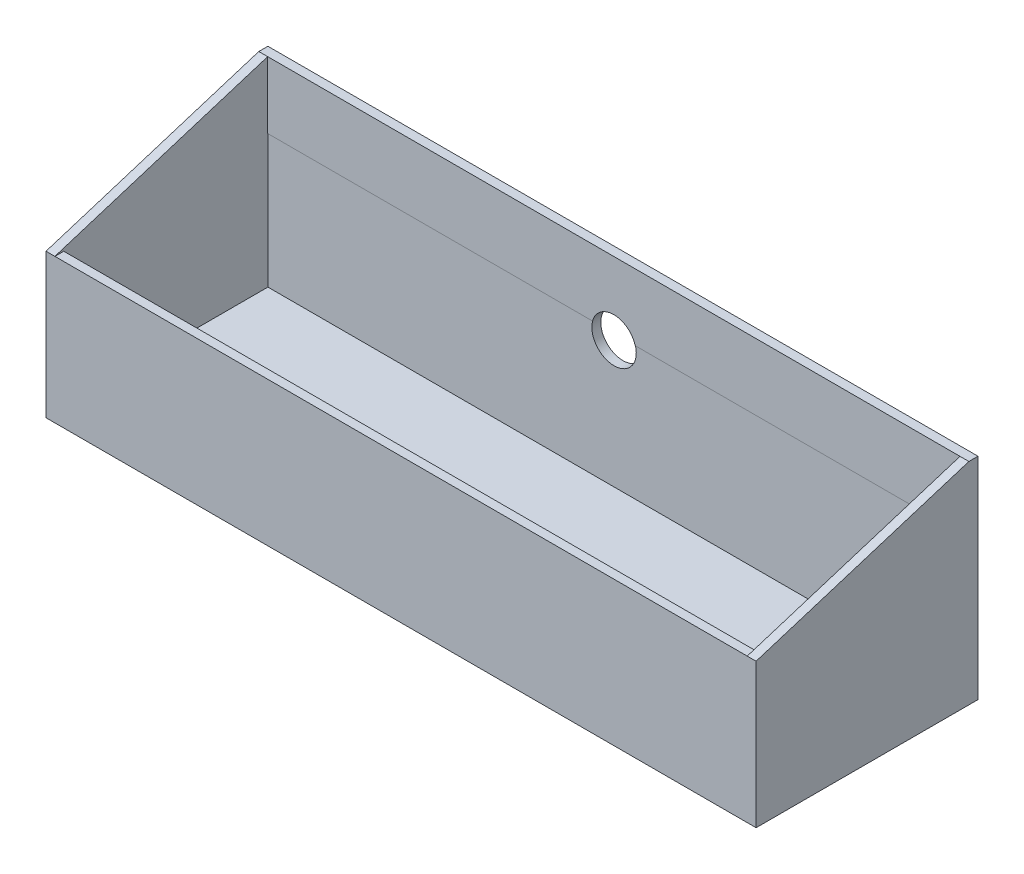
ISO-10303-21;
HEADER;
FILE_DESCRIPTION(('STEP AP214'),'2;1');
FILE_NAME('part.step','',(''),(''),'','','');
FILE_SCHEMA(('AUTOMOTIVE_DESIGN { 1 0 10303 214 1 1 1 1 }'));
ENDSEC;
DATA;
#1=APPLICATION_CONTEXT('core data for automotive mechanical design processes');
#2=APPLICATION_PROTOCOL_DEFINITION('international standard','automotive_design',2000,#1);
#3=PRODUCT_CONTEXT('',#1,'mechanical');
#4=PRODUCT('Part','Part','',(#3));
#5=PRODUCT_RELATED_PRODUCT_CATEGORY('part','',(#4));
#6=PRODUCT_DEFINITION_FORMATION('','',#4);
#7=PRODUCT_DEFINITION_CONTEXT('part definition',#1,'design');
#8=PRODUCT_DEFINITION('design','',#6,#7);
#9=PRODUCT_DEFINITION_SHAPE('','',#8);
#10=(LENGTH_UNIT() NAMED_UNIT(*) SI_UNIT(.MILLI.,.METRE.));
#11=(NAMED_UNIT(*) PLANE_ANGLE_UNIT() SI_UNIT($,.RADIAN.));
#12=(NAMED_UNIT(*) SI_UNIT($,.STERADIAN.) SOLID_ANGLE_UNIT());
#13=UNCERTAINTY_MEASURE_WITH_UNIT(LENGTH_MEASURE(1.E-05),#10,'distance_accuracy_value','');
#14=(GEOMETRIC_REPRESENTATION_CONTEXT(3) GLOBAL_UNCERTAINTY_ASSIGNED_CONTEXT((#13)) GLOBAL_UNIT_ASSIGNED_CONTEXT((#10,
#11,#12)) REPRESENTATION_CONTEXT('',''));
#15=CARTESIAN_POINT('',(0.,0.,0.));
#16=DIRECTION('',(0.,0.,1.));
#17=DIRECTION('',(1.,0.,0.));
#18=AXIS2_PLACEMENT_3D('',#15,#16,#17);
#19=CARTESIAN_POINT('',(0.,32.5,0.));
#20=DIRECTION('',(0.,1.,0.));
#21=DIRECTION('',(0.,0.,1.));
#22=AXIS2_PLACEMENT_3D('',#19,#20,#21);
#23=PLANE('',#22);
#24=DIRECTION('',(1.,0.,0.));
#25=VECTOR('',#24,1.);
#26=CARTESIAN_POINT('',(0.,32.5,2.04998441280679));
#27=LINE('',#26,#25);
#28=CARTESIAN_POINT('',(84.8152661770436,32.5,2.04998441280679));
#29=VERTEX_POINT('',#28);
#30=CARTESIAN_POINT('',(158.,32.5,2.04998441280679));
#31=VERTEX_POINT('',#30);
#32=EDGE_CURVE('E289',#29,#31,#27,.T.);
#33=ORIENTED_EDGE('',*,*,#32,.F.);
#34=DIRECTION('',(0.,0.,-1.));
#35=VECTOR('',#34,1.);
#36=CARTESIAN_POINT('',(84.8152661770436,32.5,3.));
#37=LINE('',#36,#35);
#38=CARTESIAN_POINT('',(84.8152661770436,32.5,2.));
#39=VERTEX_POINT('',#38);
#40=EDGE_CURVE('E11',#29,#39,#37,.T.);
#41=ORIENTED_EDGE('',*,*,#40,.T.);
#42=DIRECTION('',(-1.,0.,0.));
#43=VECTOR('',#42,1.);
#44=CARTESIAN_POINT('',(2.,32.5,2.));
#45=LINE('',#44,#43);
#46=CARTESIAN_POINT('',(158.,32.5,2.));
#47=VERTEX_POINT('',#46);
#48=EDGE_CURVE('E147',#47,#39,#45,.T.);
#49=ORIENTED_EDGE('',*,*,#48,.F.);
#50=DIRECTION('',(0.,0.,-1.));
#51=VECTOR('',#50,1.);
#52=CARTESIAN_POINT('',(158.,32.5,2.));
#53=LINE('',#52,#51);
#54=EDGE_CURVE('E166',#31,#47,#53,.T.);
#55=ORIENTED_EDGE('',*,*,#54,.F.);
#56=EDGE_LOOP('',(#33,#41,#49,#55));
#57=FACE_BOUND('',#56,.T.);
#58=ADVANCED_FACE('F33',(#57),#23,.F.);
#59=CARTESIAN_POINT('',(0.,32.5,0.));
#60=DIRECTION('',(0.,1.,0.));
#61=DIRECTION('',(0.,0.,1.));
#62=AXIS2_PLACEMENT_3D('',#59,#60,#61);
#63=PLANE('',#62);
#64=DIRECTION('',(1.,0.,0.));
#65=VECTOR('',#64,1.);
#66=CARTESIAN_POINT('',(2.,32.5,48.));
#67=LINE('',#66,#65);
#68=CARTESIAN_POINT('',(2.00000000000001,32.5,48.));
#69=VERTEX_POINT('',#68);
#70=CARTESIAN_POINT('',(158.,32.5,48.));
#71=VERTEX_POINT('',#70);
#72=EDGE_CURVE('E163',#69,#71,#67,.T.);
#73=ORIENTED_EDGE('',*,*,#72,.F.);
#74=DIRECTION('',(0.,0.,1.));
#75=VECTOR('',#74,1.);
#76=CARTESIAN_POINT('',(2.,32.5,2.04998441280679));
#77=LINE('',#76,#75);
#78=CARTESIAN_POINT('',(2.00000000000001,32.5,50.));
#79=VERTEX_POINT('',#78);
#80=EDGE_CURVE('E293',#69,#79,#77,.T.);
#81=ORIENTED_EDGE('',*,*,#80,.T.);
#82=DIRECTION('',(1.,0.,0.));
#83=VECTOR('',#82,1.);
#84=CARTESIAN_POINT('',(0.,32.5,50.));
#85=LINE('',#84,#83);
#86=CARTESIAN_POINT('',(158.,32.5,50.));
#87=VERTEX_POINT('',#86);
#88=EDGE_CURVE('E185',#79,#87,#85,.T.);
#89=ORIENTED_EDGE('',*,*,#88,.T.);
#90=DIRECTION('',(0.,0.,-1.));
#91=VECTOR('',#90,1.);
#92=CARTESIAN_POINT('',(158.,32.5,2.04998441280679));
#93=LINE('',#92,#91);
#94=EDGE_CURVE('E287',#87,#71,#93,.T.);
#95=ORIENTED_EDGE('',*,*,#94,.T.);
#96=EDGE_LOOP('',(#73,#81,#89,#95));
#97=FACE_BOUND('',#96,.T.);
#98=ADVANCED_FACE('F324',(#97),#63,.T.);
#99=CARTESIAN_POINT('',(0.,47.5,2.04998441280679));
#100=DIRECTION('',(0.,0.,-1.));
#101=DIRECTION('',(-1.,0.,0.));
#102=AXIS2_PLACEMENT_3D('',#99,#100,#101);
#103=PLANE('',#102);
#104=CARTESIAN_POINT('',(2.,32.5,2.04998441280679));
#105=VERTEX_POINT('',#104);
#106=CARTESIAN_POINT('',(75.1847338229564,32.5,2.04998441280679));
#107=VERTEX_POINT('',#106);
#108=EDGE_CURVE('E160',#105,#107,#27,.T.);
#109=ORIENTED_EDGE('',*,*,#108,.T.);
#110=CARTESIAN_POINT('',(80.,31.1534445261259,2.04998441280679));
#111=DIRECTION('',(0.,0.,-1.));
#112=DIRECTION('',(-1.,0.,0.));
#113=AXIS2_PLACEMENT_3D('',#110,#111,#112);
#114=CIRCLE('',#113,5.00000000000001);
#115=EDGE_CURVE('E48',#107,#29,#114,.T.);
#116=ORIENTED_EDGE('',*,*,#115,.T.);
#117=ORIENTED_EDGE('',*,*,#32,.T.);
#118=DIRECTION('',(0.,1.,0.));
#119=VECTOR('',#118,1.);
#120=CARTESIAN_POINT('',(158.,47.5,2.04998441280679));
#121=LINE('',#120,#119);
#122=CARTESIAN_POINT('',(158.,47.5,2.04998441280679));
#123=VERTEX_POINT('',#122);
#124=EDGE_CURVE('E292',#31,#123,#121,.T.);
#125=ORIENTED_EDGE('',*,*,#124,.T.);
#126=DIRECTION('',(1.,0.,0.));
#127=VECTOR('',#126,1.);
#128=CARTESIAN_POINT('',(0.,47.5,2.04998441280679));
#129=LINE('',#128,#127);
#130=CARTESIAN_POINT('',(2.,47.5,2.04998441280679));
#131=VERTEX_POINT('',#130);
#132=EDGE_CURVE('E280',#131,#123,#129,.T.);
#133=ORIENTED_EDGE('',*,*,#132,.F.);
#134=DIRECTION('',(0.,-1.,0.));
#135=VECTOR('',#134,1.);
#136=CARTESIAN_POINT('',(2.,47.5,2.04998441280679));
#137=LINE('',#136,#135);
#138=EDGE_CURVE('E304',#131,#105,#137,.T.);
#139=ORIENTED_EDGE('',*,*,#138,.T.);
#140=EDGE_LOOP('',(#109,#116,#117,#125,#133,#139));
#141=FACE_BOUND('',#140,.T.);
#142=ADVANCED_FACE('F330',(#141),#103,.F.);
#143=CARTESIAN_POINT('',(0.,2.5,0.));
#144=DIRECTION('',(1.,0.,0.));
#145=DIRECTION('',(0.,0.,-1.));
#146=AXIS2_PLACEMENT_3D('',#143,#144,#145);
#147=PLANE('',#146);
#148=DIRECTION('',(0.,-1.,0.));
#149=VECTOR('',#148,1.);
#150=CARTESIAN_POINT('',(0.,2.5,50.));
#151=LINE('',#150,#149);
#152=CARTESIAN_POINT('',(0.,32.5,50.));
#153=VERTEX_POINT('',#152);
#154=CARTESIAN_POINT('',(0.,0.,50.));
#155=VERTEX_POINT('',#154);
#156=EDGE_CURVE('E138',#153,#155,#151,.T.);
#157=ORIENTED_EDGE('',*,*,#156,.F.);
#158=DIRECTION('',(0.,0.298558220949294,-0.954391423213554));
#159=VECTOR('',#158,1.);
#160=CARTESIAN_POINT('',(0.,32.5,50.));
#161=LINE('',#160,#159);
#162=CARTESIAN_POINT('',(0.,47.5,2.04998441280679));
#163=VERTEX_POINT('',#162);
#164=EDGE_CURVE('E300',#153,#163,#161,.T.);
#165=ORIENTED_EDGE('',*,*,#164,.T.);
#166=DIRECTION('',(0.,0.,1.));
#167=VECTOR('',#166,1.);
#168=CARTESIAN_POINT('',(0.,47.5,0.));
#169=LINE('',#168,#167);
#170=CARTESIAN_POINT('',(0.,47.5,0.));
#171=VERTEX_POINT('',#170);
#172=EDGE_CURVE('E281',#171,#163,#169,.T.);
#173=ORIENTED_EDGE('',*,*,#172,.F.);
#174=DIRECTION('',(0.,-1.,0.));
#175=VECTOR('',#174,1.);
#176=CARTESIAN_POINT('',(0.,2.5,0.));
#177=LINE('',#176,#175);
#178=CARTESIAN_POINT('',(0.,0.,0.));
#179=VERTEX_POINT('',#178);
#180=EDGE_CURVE('E239',#171,#179,#177,.T.);
#181=ORIENTED_EDGE('',*,*,#180,.T.);
#182=DIRECTION('',(0.,0.,1.));
#183=VECTOR('',#182,1.);
#184=CARTESIAN_POINT('',(0.,0.,0.));
#185=LINE('',#184,#183);
#186=EDGE_CURVE('E228',#179,#155,#185,.T.);
#187=ORIENTED_EDGE('',*,*,#186,.T.);
#188=EDGE_LOOP('',(#157,#165,#173,#181,#187));
#189=FACE_BOUND('',#188,.T.);
#190=ADVANCED_FACE('F35',(#189),#147,.F.);
#191=CARTESIAN_POINT('',(0.,2.5,50.));
#192=DIRECTION('',(0.,0.,-1.));
#193=DIRECTION('',(-1.,0.,0.));
#194=AXIS2_PLACEMENT_3D('',#191,#192,#193);
#195=PLANE('',#194);
#196=DIRECTION('',(1.,0.,0.));
#197=VECTOR('',#196,1.);
#198=CARTESIAN_POINT('',(0.,0.,50.));
#199=LINE('',#198,#197);
#200=CARTESIAN_POINT('',(160.,0.,50.));
#201=VERTEX_POINT('',#200);
#202=EDGE_CURVE('E233',#155,#201,#199,.T.);
#203=ORIENTED_EDGE('',*,*,#202,.T.);
#204=DIRECTION('',(0.,-1.,0.));
#205=VECTOR('',#204,1.);
#206=CARTESIAN_POINT('',(160.,2.5,50.));
#207=LINE('',#206,#205);
#208=CARTESIAN_POINT('',(160.,32.5,50.));
#209=VERTEX_POINT('',#208);
#210=EDGE_CURVE('E245',#209,#201,#207,.T.);
#211=ORIENTED_EDGE('',*,*,#210,.F.);
#212=DIRECTION('',(1.,0.,0.));
#213=VECTOR('',#212,1.);
#214=CARTESIAN_POINT('',(158.,32.5,50.));
#215=LINE('',#214,#213);
#216=EDGE_CURVE('E286',#87,#209,#215,.T.);
#217=ORIENTED_EDGE('',*,*,#216,.F.);
#218=ORIENTED_EDGE('',*,*,#88,.F.);
#219=EDGE_CURVE('E186',#153,#79,#85,.T.);
#220=ORIENTED_EDGE('',*,*,#219,.F.);
#221=ORIENTED_EDGE('',*,*,#156,.T.);
#222=EDGE_LOOP('',(#203,#211,#217,#218,#220,#221));
#223=FACE_BOUND('',#222,.T.);
#224=ADVANCED_FACE('F252',(#223),#195,.F.);
#225=CARTESIAN_POINT('',(160.,2.5,0.));
#226=DIRECTION('',(-1.,0.,0.));
#227=DIRECTION('',(0.,0.,1.));
#228=AXIS2_PLACEMENT_3D('',#225,#226,#227);
#229=PLANE('',#228);
#230=DIRECTION('',(0.,0.,-1.));
#231=VECTOR('',#230,1.);
#232=CARTESIAN_POINT('',(160.,0.,0.));
#233=LINE('',#232,#231);
#234=CARTESIAN_POINT('',(160.,0.,0.));
#235=VERTEX_POINT('',#234);
#236=EDGE_CURVE('E235',#201,#235,#233,.T.);
#237=ORIENTED_EDGE('',*,*,#236,.T.);
#238=DIRECTION('',(0.,-1.,0.));
#239=VECTOR('',#238,1.);
#240=CARTESIAN_POINT('',(160.,2.5,0.));
#241=LINE('',#240,#239);
#242=CARTESIAN_POINT('',(160.,47.5,0.));
#243=VERTEX_POINT('',#242);
#244=EDGE_CURVE('E242',#243,#235,#241,.T.);
#245=ORIENTED_EDGE('',*,*,#244,.F.);
#246=DIRECTION('',(0.,0.,-1.));
#247=VECTOR('',#246,1.);
#248=CARTESIAN_POINT('',(160.,47.5,0.));
#249=LINE('',#248,#247);
#250=CARTESIAN_POINT('',(160.,47.5,2.04998441280679));
#251=VERTEX_POINT('',#250);
#252=EDGE_CURVE('E274',#251,#243,#249,.T.);
#253=ORIENTED_EDGE('',*,*,#252,.F.);
#254=DIRECTION('',(0.,-0.298558220949294,0.954391423213554));
#255=VECTOR('',#254,1.);
#256=CARTESIAN_POINT('',(160.,32.5,50.));
#257=LINE('',#256,#255);
#258=EDGE_CURVE('E290',#251,#209,#257,.T.);
#259=ORIENTED_EDGE('',*,*,#258,.T.);
#260=ORIENTED_EDGE('',*,*,#210,.T.);
#261=EDGE_LOOP('',(#237,#245,#253,#259,#260));
#262=FACE_BOUND('',#261,.T.);
#263=ADVANCED_FACE('F264',(#262),#229,.F.);
#264=CARTESIAN_POINT('',(0.,2.5,0.));
#265=DIRECTION('',(0.,0.,1.));
#266=DIRECTION('',(1.,0.,0.));
#267=AXIS2_PLACEMENT_3D('',#264,#265,#266);
#268=PLANE('',#267);
#269=CARTESIAN_POINT('',(80.,31.1534445261259,0.));
#270=DIRECTION('',(0.,0.,-1.));
#271=DIRECTION('',(-1.,0.,0.));
#272=AXIS2_PLACEMENT_3D('',#269,#270,#271);
#273=CIRCLE('',#272,5.00000000000001);
#274=CARTESIAN_POINT('',(75.,31.1534445261259,0.));
#275=VERTEX_POINT('',#274);
#276=EDGE_CURVE('E148',#275,#275,#273,.T.);
#277=ORIENTED_EDGE('',*,*,#276,.F.);
#278=EDGE_LOOP('',(#277));
#279=FACE_BOUND('',#278,.T.);
#280=DIRECTION('',(-1.,0.,0.));
#281=VECTOR('',#280,1.);
#282=CARTESIAN_POINT('',(0.,0.,0.));
#283=LINE('',#282,#281);
#284=EDGE_CURVE('E237',#235,#179,#283,.T.);
#285=ORIENTED_EDGE('',*,*,#284,.T.);
#286=ORIENTED_EDGE('',*,*,#180,.F.);
#287=DIRECTION('',(-1.,0.,0.));
#288=VECTOR('',#287,1.);
#289=CARTESIAN_POINT('',(0.,47.5,0.));
#290=LINE('',#289,#288);
#291=EDGE_CURVE('E172',#243,#171,#290,.T.);
#292=ORIENTED_EDGE('',*,*,#291,.F.);
#293=ORIENTED_EDGE('',*,*,#244,.T.);
#294=EDGE_LOOP('',(#285,#286,#292,#293));
#295=FACE_BOUND('',#294,.T.);
#296=ADVANCED_FACE('F270',(#279,#295),#268,.F.);
#297=CARTESIAN_POINT('',(0.,2.5,0.));
#298=DIRECTION('',(0.,1.,0.));
#299=DIRECTION('',(0.,0.,1.));
#300=AXIS2_PLACEMENT_3D('',#297,#298,#299);
#301=PLANE('',#300);
#302=DIRECTION('',(-1.,0.,0.));
#303=VECTOR('',#302,1.);
#304=CARTESIAN_POINT('',(2.,2.5,2.));
#305=LINE('',#304,#303);
#306=CARTESIAN_POINT('',(158.,2.5,2.));
#307=VERTEX_POINT('',#306);
#308=CARTESIAN_POINT('',(2.,2.5,2.));
#309=VERTEX_POINT('',#308);
#310=EDGE_CURVE('E169',#307,#309,#305,.T.);
#311=ORIENTED_EDGE('',*,*,#310,.T.);
#312=DIRECTION('',(0.,0.,1.));
#313=VECTOR('',#312,1.);
#314=CARTESIAN_POINT('',(2.,2.5,2.));
#315=LINE('',#314,#313);
#316=CARTESIAN_POINT('',(2.,2.5,48.));
#317=VERTEX_POINT('',#316);
#318=EDGE_CURVE('E171',#309,#317,#315,.T.);
#319=ORIENTED_EDGE('',*,*,#318,.T.);
#320=DIRECTION('',(1.,0.,0.));
#321=VECTOR('',#320,1.);
#322=CARTESIAN_POINT('',(2.,2.5,48.));
#323=LINE('',#322,#321);
#324=CARTESIAN_POINT('',(158.,2.5,48.));
#325=VERTEX_POINT('',#324);
#326=EDGE_CURVE('E156',#317,#325,#323,.T.);
#327=ORIENTED_EDGE('',*,*,#326,.T.);
#328=DIRECTION('',(0.,0.,-1.));
#329=VECTOR('',#328,1.);
#330=CARTESIAN_POINT('',(158.,2.5,2.));
#331=LINE('',#330,#329);
#332=EDGE_CURVE('E154',#325,#307,#331,.T.);
#333=ORIENTED_EDGE('',*,*,#332,.T.);
#334=EDGE_LOOP('',(#311,#319,#327,#333));
#335=FACE_BOUND('',#334,.T.);
#336=CARTESIAN_POINT('',(36.,2.5,25.));
#337=DIRECTION('',(0.,1.,0.));
#338=DIRECTION('',(0.,0.,1.));
#339=AXIS2_PLACEMENT_3D('',#336,#337,#338);
#340=CIRCLE('',#339,3.75);
#341=CARTESIAN_POINT('',(36.,2.5,28.75));
#342=VERTEX_POINT('',#341);
#343=EDGE_CURVE('E193',#342,#342,#340,.T.);
#344=ORIENTED_EDGE('',*,*,#343,.F.);
#345=EDGE_LOOP('',(#344));
#346=FACE_BOUND('',#345,.T.);
#347=CARTESIAN_POINT('',(57.,2.5,25.));
#348=DIRECTION('',(0.,1.,0.));
#349=DIRECTION('',(0.,0.,1.));
#350=AXIS2_PLACEMENT_3D('',#347,#348,#349);
#351=CIRCLE('',#350,3.75000000000001);
#352=CARTESIAN_POINT('',(57.,2.5,28.75));
#353=VERTEX_POINT('',#352);
#354=EDGE_CURVE('E199',#353,#353,#351,.T.);
#355=ORIENTED_EDGE('',*,*,#354,.F.);
#356=EDGE_LOOP('',(#355));
#357=FACE_BOUND('',#356,.T.);
#358=CARTESIAN_POINT('',(78.,2.5,25.));
#359=DIRECTION('',(0.,1.,0.));
#360=DIRECTION('',(0.,0.,1.));
#361=AXIS2_PLACEMENT_3D('',#358,#359,#360);
#362=CIRCLE('',#361,3.75000000000001);
#363=CARTESIAN_POINT('',(78.,2.5,28.75));
#364=VERTEX_POINT('',#363);
#365=EDGE_CURVE('E205',#364,#364,#362,.T.);
#366=ORIENTED_EDGE('',*,*,#365,.F.);
#367=EDGE_LOOP('',(#366));
#368=FACE_BOUND('',#367,.T.);
#369=CARTESIAN_POINT('',(99.,2.5,25.));
#370=DIRECTION('',(0.,1.,0.));
#371=DIRECTION('',(0.,0.,1.));
#372=AXIS2_PLACEMENT_3D('',#369,#370,#371);
#373=CIRCLE('',#372,3.75000000000001);
#374=CARTESIAN_POINT('',(99.,2.5,28.75));
#375=VERTEX_POINT('',#374);
#376=EDGE_CURVE('E211',#375,#375,#373,.T.);
#377=ORIENTED_EDGE('',*,*,#376,.F.);
#378=EDGE_LOOP('',(#377));
#379=FACE_BOUND('',#378,.T.);
#380=CARTESIAN_POINT('',(120.,2.5,25.));
#381=DIRECTION('',(0.,1.,0.));
#382=DIRECTION('',(0.,0.,1.));
#383=AXIS2_PLACEMENT_3D('',#380,#381,#382);
#384=CIRCLE('',#383,3.75000000000001);
#385=CARTESIAN_POINT('',(120.,2.5,28.75));
#386=VERTEX_POINT('',#385);
#387=EDGE_CURVE('E217',#386,#386,#384,.T.);
#388=ORIENTED_EDGE('',*,*,#387,.F.);
#389=EDGE_LOOP('',(#388));
#390=FACE_BOUND('',#389,.T.);
#391=CARTESIAN_POINT('',(141.,2.5,25.));
#392=DIRECTION('',(0.,1.,0.));
#393=DIRECTION('',(0.,0.,1.));
#394=AXIS2_PLACEMENT_3D('',#391,#392,#393);
#395=CIRCLE('',#394,3.75000000000001);
#396=CARTESIAN_POINT('',(141.,2.5,28.75));
#397=VERTEX_POINT('',#396);
#398=EDGE_CURVE('E188',#397,#397,#395,.T.);
#399=ORIENTED_EDGE('',*,*,#398,.F.);
#400=EDGE_LOOP('',(#399));
#401=FACE_BOUND('',#400,.T.);
#402=CARTESIAN_POINT('',(15.,2.5,25.));
#403=DIRECTION('',(0.,1.,0.));
#404=DIRECTION('',(0.,0.,1.));
#405=AXIS2_PLACEMENT_3D('',#402,#403,#404);
#406=CIRCLE('',#405,3.75);
#407=CARTESIAN_POINT('',(15.,2.5,28.75));
#408=VERTEX_POINT('',#407);
#409=EDGE_CURVE('E192',#408,#408,#406,.T.);
#410=ORIENTED_EDGE('',*,*,#409,.F.);
#411=EDGE_LOOP('',(#410));
#412=FACE_BOUND('',#411,.T.);
#413=ADVANCED_FACE('F313',(#335,#346,#357,#368,#379,#390,#401,#412),#301,.T.);
#414=CARTESIAN_POINT('',(0.,0.,0.));
#415=DIRECTION('',(0.,1.,0.));
#416=DIRECTION('',(0.,0.,1.));
#417=AXIS2_PLACEMENT_3D('',#414,#415,#416);
#418=PLANE('',#417);
#419=CARTESIAN_POINT('',(36.,0.,25.));
#420=DIRECTION('',(0.,1.,0.));
#421=DIRECTION('',(0.,0.,1.));
#422=AXIS2_PLACEMENT_3D('',#419,#420,#421);
#423=CIRCLE('',#422,3.75);
#424=CARTESIAN_POINT('',(36.,0.,28.75));
#425=VERTEX_POINT('',#424);
#426=EDGE_CURVE('E189',#425,#425,#423,.T.);
#427=ORIENTED_EDGE('',*,*,#426,.T.);
#428=EDGE_LOOP('',(#427));
#429=FACE_BOUND('',#428,.T.);
#430=CARTESIAN_POINT('',(57.,0.,25.));
#431=DIRECTION('',(0.,1.,0.));
#432=DIRECTION('',(0.,0.,1.));
#433=AXIS2_PLACEMENT_3D('',#430,#431,#432);
#434=CIRCLE('',#433,3.75000000000001);
#435=CARTESIAN_POINT('',(57.,0.,28.75));
#436=VERTEX_POINT('',#435);
#437=EDGE_CURVE('E196',#436,#436,#434,.T.);
#438=ORIENTED_EDGE('',*,*,#437,.T.);
#439=EDGE_LOOP('',(#438));
#440=FACE_BOUND('',#439,.T.);
#441=CARTESIAN_POINT('',(78.,0.,25.));
#442=DIRECTION('',(0.,1.,0.));
#443=DIRECTION('',(0.,0.,1.));
#444=AXIS2_PLACEMENT_3D('',#441,#442,#443);
#445=CIRCLE('',#444,3.75000000000001);
#446=CARTESIAN_POINT('',(78.,0.,28.75));
#447=VERTEX_POINT('',#446);
#448=EDGE_CURVE('E202',#447,#447,#445,.T.);
#449=ORIENTED_EDGE('',*,*,#448,.T.);
#450=EDGE_LOOP('',(#449));
#451=FACE_BOUND('',#450,.T.);
#452=CARTESIAN_POINT('',(99.,0.,25.));
#453=DIRECTION('',(0.,1.,0.));
#454=DIRECTION('',(0.,0.,1.));
#455=AXIS2_PLACEMENT_3D('',#452,#453,#454);
#456=CIRCLE('',#455,3.75000000000001);
#457=CARTESIAN_POINT('',(99.,0.,28.75));
#458=VERTEX_POINT('',#457);
#459=EDGE_CURVE('E208',#458,#458,#456,.T.);
#460=ORIENTED_EDGE('',*,*,#459,.T.);
#461=EDGE_LOOP('',(#460));
#462=FACE_BOUND('',#461,.T.);
#463=CARTESIAN_POINT('',(120.,0.,25.));
#464=DIRECTION('',(0.,1.,0.));
#465=DIRECTION('',(0.,0.,1.));
#466=AXIS2_PLACEMENT_3D('',#463,#464,#465);
#467=CIRCLE('',#466,3.75000000000001);
#468=CARTESIAN_POINT('',(120.,0.,28.75));
#469=VERTEX_POINT('',#468);
#470=EDGE_CURVE('E214',#469,#469,#467,.T.);
#471=ORIENTED_EDGE('',*,*,#470,.T.);
#472=EDGE_LOOP('',(#471));
#473=FACE_BOUND('',#472,.T.);
#474=CARTESIAN_POINT('',(141.,0.,25.));
#475=DIRECTION('',(0.,1.,0.));
#476=DIRECTION('',(0.,0.,1.));
#477=AXIS2_PLACEMENT_3D('',#474,#475,#476);
#478=CIRCLE('',#477,3.75000000000001);
#479=CARTESIAN_POINT('',(141.,0.,28.75));
#480=VERTEX_POINT('',#479);
#481=EDGE_CURVE('E220',#480,#480,#478,.T.);
#482=ORIENTED_EDGE('',*,*,#481,.T.);
#483=EDGE_LOOP('',(#482));
#484=FACE_BOUND('',#483,.T.);
#485=CARTESIAN_POINT('',(15.,0.,25.));
#486=DIRECTION('',(0.,1.,0.));
#487=DIRECTION('',(0.,0.,1.));
#488=AXIS2_PLACEMENT_3D('',#485,#486,#487);
#489=CIRCLE('',#488,3.75);
#490=CARTESIAN_POINT('',(15.,0.,28.75));
#491=VERTEX_POINT('',#490);
#492=EDGE_CURVE('E225',#491,#491,#489,.T.);
#493=ORIENTED_EDGE('',*,*,#492,.T.);
#494=EDGE_LOOP('',(#493));
#495=FACE_BOUND('',#494,.T.);
#496=ORIENTED_EDGE('',*,*,#186,.F.);
#497=ORIENTED_EDGE('',*,*,#284,.F.);
#498=ORIENTED_EDGE('',*,*,#236,.F.);
#499=ORIENTED_EDGE('',*,*,#202,.F.);
#500=EDGE_LOOP('',(#496,#497,#498,#499));
#501=FACE_BOUND('',#500,.T.);
#502=ADVANCED_FACE('F261',(#429,#440,#451,#462,#473,#484,#495,#501),#418,.F.);
#503=CARTESIAN_POINT('',(15.,0.,25.));
#504=DIRECTION('',(0.,1.,0.));
#505=DIRECTION('',(0.,0.,1.));
#506=AXIS2_PLACEMENT_3D('',#503,#504,#505);
#507=CYLINDRICAL_SURFACE('',#506,3.75);
#508=ORIENTED_EDGE('',*,*,#492,.F.);
#509=EDGE_LOOP('',(#508));
#510=FACE_BOUND('',#509,.T.);
#511=ORIENTED_EDGE('',*,*,#409,.T.);
#512=EDGE_LOOP('',(#511));
#513=FACE_BOUND('',#512,.T.);
#514=ADVANCED_FACE('F507',(#510,#513),#507,.F.);
#515=CARTESIAN_POINT('',(141.,0.,25.));
#516=DIRECTION('',(0.,1.,0.));
#517=DIRECTION('',(0.,0.,1.));
#518=AXIS2_PLACEMENT_3D('',#515,#516,#517);
#519=CYLINDRICAL_SURFACE('',#518,3.75000000000001);
#520=ORIENTED_EDGE('',*,*,#481,.F.);
#521=EDGE_LOOP('',(#520));
#522=FACE_BOUND('',#521,.T.);
#523=ORIENTED_EDGE('',*,*,#398,.T.);
#524=EDGE_LOOP('',(#523));
#525=FACE_BOUND('',#524,.T.);
#526=ADVANCED_FACE('F498',(#522,#525),#519,.F.);
#527=CARTESIAN_POINT('',(120.,0.,25.));
#528=DIRECTION('',(0.,1.,0.));
#529=DIRECTION('',(0.,0.,1.));
#530=AXIS2_PLACEMENT_3D('',#527,#528,#529);
#531=CYLINDRICAL_SURFACE('',#530,3.75000000000001);
#532=ORIENTED_EDGE('',*,*,#470,.F.);
#533=EDGE_LOOP('',(#532));
#534=FACE_BOUND('',#533,.T.);
#535=ORIENTED_EDGE('',*,*,#387,.T.);
#536=EDGE_LOOP('',(#535));
#537=FACE_BOUND('',#536,.T.);
#538=ADVANCED_FACE('F489',(#534,#537),#531,.F.);
#539=CARTESIAN_POINT('',(99.,0.,25.));
#540=DIRECTION('',(0.,1.,0.));
#541=DIRECTION('',(0.,0.,1.));
#542=AXIS2_PLACEMENT_3D('',#539,#540,#541);
#543=CYLINDRICAL_SURFACE('',#542,3.75000000000001);
#544=ORIENTED_EDGE('',*,*,#459,.F.);
#545=EDGE_LOOP('',(#544));
#546=FACE_BOUND('',#545,.T.);
#547=ORIENTED_EDGE('',*,*,#376,.T.);
#548=EDGE_LOOP('',(#547));
#549=FACE_BOUND('',#548,.T.);
#550=ADVANCED_FACE('F480',(#546,#549),#543,.F.);
#551=CARTESIAN_POINT('',(78.,0.,25.));
#552=DIRECTION('',(0.,1.,0.));
#553=DIRECTION('',(0.,0.,1.));
#554=AXIS2_PLACEMENT_3D('',#551,#552,#553);
#555=CYLINDRICAL_SURFACE('',#554,3.75000000000001);
#556=ORIENTED_EDGE('',*,*,#448,.F.);
#557=EDGE_LOOP('',(#556));
#558=FACE_BOUND('',#557,.T.);
#559=ORIENTED_EDGE('',*,*,#365,.T.);
#560=EDGE_LOOP('',(#559));
#561=FACE_BOUND('',#560,.T.);
#562=ADVANCED_FACE('F471',(#558,#561),#555,.F.);
#563=CARTESIAN_POINT('',(57.,0.,25.));
#564=DIRECTION('',(0.,1.,0.));
#565=DIRECTION('',(0.,0.,1.));
#566=AXIS2_PLACEMENT_3D('',#563,#564,#565);
#567=CYLINDRICAL_SURFACE('',#566,3.75000000000001);
#568=ORIENTED_EDGE('',*,*,#437,.F.);
#569=EDGE_LOOP('',(#568));
#570=FACE_BOUND('',#569,.T.);
#571=ORIENTED_EDGE('',*,*,#354,.T.);
#572=EDGE_LOOP('',(#571));
#573=FACE_BOUND('',#572,.T.);
#574=ADVANCED_FACE('F462',(#570,#573),#567,.F.);
#575=CARTESIAN_POINT('',(36.,0.,25.));
#576=DIRECTION('',(0.,1.,0.));
#577=DIRECTION('',(0.,0.,1.));
#578=AXIS2_PLACEMENT_3D('',#575,#576,#577);
#579=CYLINDRICAL_SURFACE('',#578,3.75);
#580=ORIENTED_EDGE('',*,*,#426,.F.);
#581=EDGE_LOOP('',(#580));
#582=FACE_BOUND('',#581,.T.);
#583=ORIENTED_EDGE('',*,*,#343,.T.);
#584=EDGE_LOOP('',(#583));
#585=FACE_BOUND('',#584,.T.);
#586=ADVANCED_FACE('F456',(#582,#585),#579,.F.);
#587=CARTESIAN_POINT('',(2.,32.5,2.));
#588=DIRECTION('',(0.,0.,1.));
#589=DIRECTION('',(1.,0.,0.));
#590=AXIS2_PLACEMENT_3D('',#587,#588,#589);
#591=PLANE('',#590);
#592=CARTESIAN_POINT('',(80.,31.1534445261259,2.));
#593=DIRECTION('',(0.,0.,1.));
#594=DIRECTION('',(1.,0.,0.));
#595=AXIS2_PLACEMENT_3D('',#592,#593,#594);
#596=CIRCLE('',#595,5.00000000000001);
#597=CARTESIAN_POINT('',(75.1847338229564,32.5,2.));
#598=VERTEX_POINT('',#597);
#599=EDGE_CURVE('E133',#598,#39,#596,.T.);
#600=ORIENTED_EDGE('',*,*,#599,.F.);
#601=CARTESIAN_POINT('',(2.,32.5,2.));
#602=VERTEX_POINT('',#601);
#603=EDGE_CURVE('E143',#598,#602,#45,.T.);
#604=ORIENTED_EDGE('',*,*,#603,.T.);
#605=DIRECTION('',(0.,-1.,0.));
#606=VECTOR('',#605,1.);
#607=CARTESIAN_POINT('',(2.,32.5,2.));
#608=LINE('',#607,#606);
#609=EDGE_CURVE('E183',#602,#309,#608,.T.);
#610=ORIENTED_EDGE('',*,*,#609,.T.);
#611=ORIENTED_EDGE('',*,*,#310,.F.);
#612=DIRECTION('',(0.,-1.,0.));
#613=VECTOR('',#612,1.);
#614=CARTESIAN_POINT('',(158.,32.5,2.));
#615=LINE('',#614,#613);
#616=EDGE_CURVE('E168',#47,#307,#615,.T.);
#617=ORIENTED_EDGE('',*,*,#616,.F.);
#618=ORIENTED_EDGE('',*,*,#48,.T.);
#619=EDGE_LOOP('',(#600,#604,#610,#611,#617,#618));
#620=FACE_BOUND('',#619,.T.);
#621=ADVANCED_FACE('F141',(#620),#591,.T.);
#622=CARTESIAN_POINT('',(2.,32.5,2.));
#623=DIRECTION('',(1.,0.,0.));
#624=DIRECTION('',(0.,0.,-1.));
#625=AXIS2_PLACEMENT_3D('',#622,#623,#624);
#626=PLANE('',#625);
#627=ORIENTED_EDGE('',*,*,#318,.F.);
#628=ORIENTED_EDGE('',*,*,#609,.F.);
#629=DIRECTION('',(0.,0.,1.));
#630=VECTOR('',#629,1.);
#631=CARTESIAN_POINT('',(2.,32.5,2.));
#632=LINE('',#631,#630);
#633=EDGE_CURVE('E153',#602,#105,#632,.T.);
#634=ORIENTED_EDGE('',*,*,#633,.T.);
#635=ORIENTED_EDGE('',*,*,#138,.F.);
#636=DIRECTION('',(0.,0.298558220949294,-0.954391423213554));
#637=VECTOR('',#636,1.);
#638=CARTESIAN_POINT('',(2.00000000000001,32.5,50.));
#639=LINE('',#638,#637);
#640=EDGE_CURVE('E56',#79,#131,#639,.T.);
#641=ORIENTED_EDGE('',*,*,#640,.F.);
#642=ORIENTED_EDGE('',*,*,#80,.F.);
#643=DIRECTION('',(0.,-1.,0.));
#644=VECTOR('',#643,1.);
#645=CARTESIAN_POINT('',(2.,32.5,48.));
#646=LINE('',#645,#644);
#647=EDGE_CURVE('E180',#69,#317,#646,.T.);
#648=ORIENTED_EDGE('',*,*,#647,.T.);
#649=EDGE_LOOP('',(#627,#628,#634,#635,#641,#642,#648));
#650=FACE_BOUND('',#649,.T.);
#651=ADVANCED_FACE('F403',(#650),#626,.T.);
#652=CARTESIAN_POINT('',(2.,32.5,48.));
#653=DIRECTION('',(0.,0.,-1.));
#654=DIRECTION('',(-1.,0.,0.));
#655=AXIS2_PLACEMENT_3D('',#652,#653,#654);
#656=PLANE('',#655);
#657=ORIENTED_EDGE('',*,*,#326,.F.);
#658=ORIENTED_EDGE('',*,*,#647,.F.);
#659=ORIENTED_EDGE('',*,*,#72,.T.);
#660=DIRECTION('',(0.,-1.,0.));
#661=VECTOR('',#660,1.);
#662=CARTESIAN_POINT('',(158.,32.5,48.));
#663=LINE('',#662,#661);
#664=EDGE_CURVE('E177',#71,#325,#663,.T.);
#665=ORIENTED_EDGE('',*,*,#664,.T.);
#666=EDGE_LOOP('',(#657,#658,#659,#665));
#667=FACE_BOUND('',#666,.T.);
#668=ADVANCED_FACE('F350',(#667),#656,.T.);
#669=CARTESIAN_POINT('',(158.,32.5,2.));
#670=DIRECTION('',(-1.,0.,0.));
#671=DIRECTION('',(0.,0.,1.));
#672=AXIS2_PLACEMENT_3D('',#669,#670,#671);
#673=PLANE('',#672);
#674=ORIENTED_EDGE('',*,*,#332,.F.);
#675=ORIENTED_EDGE('',*,*,#664,.F.);
#676=ORIENTED_EDGE('',*,*,#94,.F.);
#677=DIRECTION('',(0.,-0.298558220949294,0.954391423213554));
#678=VECTOR('',#677,1.);
#679=CARTESIAN_POINT('',(158.,32.5,50.));
#680=LINE('',#679,#678);
#681=EDGE_CURVE('E295',#123,#87,#680,.T.);
#682=ORIENTED_EDGE('',*,*,#681,.F.);
#683=ORIENTED_EDGE('',*,*,#124,.F.);
#684=ORIENTED_EDGE('',*,*,#54,.T.);
#685=ORIENTED_EDGE('',*,*,#616,.T.);
#686=EDGE_LOOP('',(#674,#675,#676,#682,#683,#684,#685));
#687=FACE_BOUND('',#686,.T.);
#688=ADVANCED_FACE('F346',(#687),#673,.T.);
#689=CARTESIAN_POINT('',(0.,47.5,0.));
#690=DIRECTION('',(0.,1.,0.));
#691=DIRECTION('',(0.,0.,1.));
#692=AXIS2_PLACEMENT_3D('',#689,#690,#691);
#693=PLANE('',#692);
#694=ORIENTED_EDGE('',*,*,#172,.T.);
#695=EDGE_CURVE('E275',#163,#131,#129,.T.);
#696=ORIENTED_EDGE('',*,*,#695,.T.);
#697=ORIENTED_EDGE('',*,*,#132,.T.);
#698=DIRECTION('',(1.,0.,0.));
#699=VECTOR('',#698,1.);
#700=CARTESIAN_POINT('',(158.,47.5,2.04998441280679));
#701=LINE('',#700,#699);
#702=EDGE_CURVE('E283',#123,#251,#701,.T.);
#703=ORIENTED_EDGE('',*,*,#702,.T.);
#704=ORIENTED_EDGE('',*,*,#252,.T.);
#705=ORIENTED_EDGE('',*,*,#291,.T.);
#706=EDGE_LOOP('',(#694,#696,#697,#703,#704,#705));
#707=FACE_BOUND('',#706,.T.);
#708=ADVANCED_FACE('F338',(#707),#693,.T.);
#709=ORIENTED_EDGE('',*,*,#603,.F.);
#710=DIRECTION('',(0.,0.,-1.));
#711=VECTOR('',#710,1.);
#712=CARTESIAN_POINT('',(75.1847338229564,32.5,3.));
#713=LINE('',#712,#711);
#714=EDGE_CURVE('E41',#598,#107,#713,.F.);
#715=ORIENTED_EDGE('',*,*,#714,.T.);
#716=ORIENTED_EDGE('',*,*,#108,.F.);
#717=ORIENTED_EDGE('',*,*,#633,.F.);
#718=EDGE_LOOP('',(#709,#715,#716,#717));
#719=FACE_BOUND('',#718,.T.);
#720=ADVANCED_FACE('F151',(#719),#23,.F.);
#721=CARTESIAN_POINT('',(158.,32.5,50.));
#722=DIRECTION('',(0.,0.954391423213554,0.298558220949294));
#723=DIRECTION('',(0.,-0.298558220949294,0.954391423213554));
#724=AXIS2_PLACEMENT_3D('',#721,#722,#723);
#725=PLANE('',#724);
#726=ORIENTED_EDGE('',*,*,#258,.F.);
#727=ORIENTED_EDGE('',*,*,#702,.F.);
#728=ORIENTED_EDGE('',*,*,#681,.T.);
#729=ORIENTED_EDGE('',*,*,#216,.T.);
#730=EDGE_LOOP('',(#726,#727,#728,#729));
#731=FACE_BOUND('',#730,.T.);
#732=ADVANCED_FACE('F337',(#731),#725,.T.);
#733=CARTESIAN_POINT('',(2.00000000000001,32.5,50.));
#734=DIRECTION('',(0.,0.954391423213554,0.298558220949294));
#735=DIRECTION('',(0.,-0.298558220949294,0.954391423213554));
#736=AXIS2_PLACEMENT_3D('',#733,#734,#735);
#737=PLANE('',#736);
#738=ORIENTED_EDGE('',*,*,#164,.F.);
#739=ORIENTED_EDGE('',*,*,#219,.T.);
#740=ORIENTED_EDGE('',*,*,#640,.T.);
#741=ORIENTED_EDGE('',*,*,#695,.F.);
#742=EDGE_LOOP('',(#738,#739,#740,#741));
#743=FACE_BOUND('',#742,.T.);
#744=ADVANCED_FACE('F343',(#743),#737,.T.);
#745=CARTESIAN_POINT('',(80.,31.1534445261259,3.));
#746=DIRECTION('',(0.,0.,-1.));
#747=DIRECTION('',(-1.,0.,0.));
#748=AXIS2_PLACEMENT_3D('',#745,#746,#747);
#749=CYLINDRICAL_SURFACE('',#748,5.00000000000001);
#750=ORIENTED_EDGE('',*,*,#276,.T.);
#751=EDGE_LOOP('',(#750));
#752=FACE_BOUND('',#751,.T.);
#753=ORIENTED_EDGE('',*,*,#115,.F.);
#754=ORIENTED_EDGE('',*,*,#714,.F.);
#755=ORIENTED_EDGE('',*,*,#599,.T.);
#756=ORIENTED_EDGE('',*,*,#40,.F.);
#757=EDGE_LOOP('',(#753,#754,#755,#756));
#758=FACE_BOUND('',#757,.T.);
#759=ADVANCED_FACE('F132',(#752,#758),#749,.F.);
#760=CLOSED_SHELL('',(#58,#98,#142,#190,#224,#263,#296,#413,#502,#514,#526,#538,#550,#562,#574,
#586,#621,#651,#668,#688,#708,#720,#732,#744,#759));
#761=MANIFOLD_SOLID_BREP('B2',#760);
#762=ADVANCED_BREP_SHAPE_REPRESENTATION('',(#18,#761),#14);
#763=SHAPE_DEFINITION_REPRESENTATION(#9,#762);
ENDSEC;
END-ISO-10303-21;
